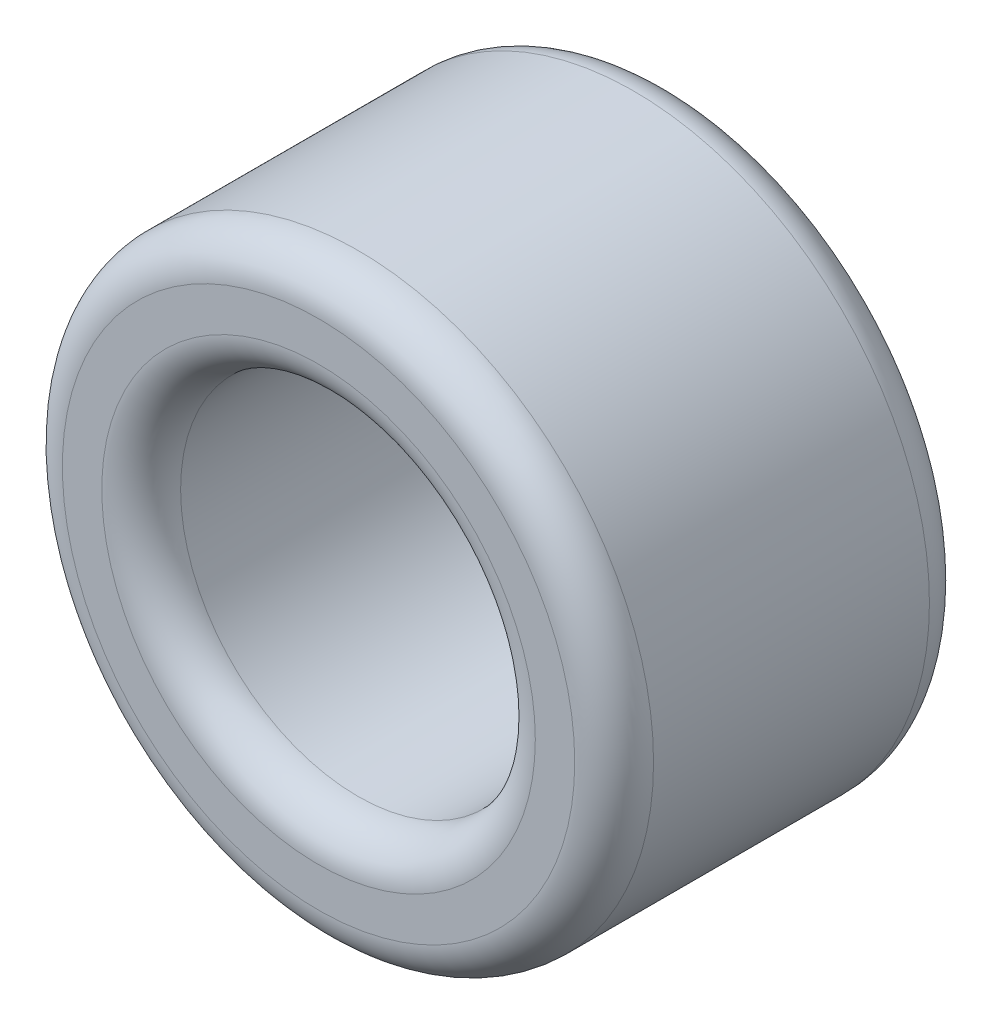
ISO-10303-21;
HEADER;
FILE_DESCRIPTION(('STEP AP214'),'2;1');
FILE_NAME('part.step','',(''),(''),'','','');
FILE_SCHEMA(('AUTOMOTIVE_DESIGN { 1 0 10303 214 1 1 1 1 }'));
ENDSEC;
DATA;
#1=APPLICATION_CONTEXT('core data for automotive mechanical design processes');
#2=APPLICATION_PROTOCOL_DEFINITION('international standard','automotive_design',2000,#1);
#3=PRODUCT_CONTEXT('',#1,'mechanical');
#4=PRODUCT('Part','Part','',(#3));
#5=PRODUCT_RELATED_PRODUCT_CATEGORY('part','',(#4));
#6=PRODUCT_DEFINITION_FORMATION('','',#4);
#7=PRODUCT_DEFINITION_CONTEXT('part definition',#1,'design');
#8=PRODUCT_DEFINITION('design','',#6,#7);
#9=PRODUCT_DEFINITION_SHAPE('','',#8);
#10=(LENGTH_UNIT() NAMED_UNIT(*) SI_UNIT(.MILLI.,.METRE.));
#11=(NAMED_UNIT(*) PLANE_ANGLE_UNIT() SI_UNIT($,.RADIAN.));
#12=(NAMED_UNIT(*) SI_UNIT($,.STERADIAN.) SOLID_ANGLE_UNIT());
#13=UNCERTAINTY_MEASURE_WITH_UNIT(LENGTH_MEASURE(1.E-05),#10,'distance_accuracy_value','');
#14=(GEOMETRIC_REPRESENTATION_CONTEXT(3) GLOBAL_UNCERTAINTY_ASSIGNED_CONTEXT((#13)) GLOBAL_UNIT_ASSIGNED_CONTEXT((#10,
#11,#12)) REPRESENTATION_CONTEXT('',''));
#15=CARTESIAN_POINT('',(0.,0.,0.));
#16=DIRECTION('',(0.,0.,1.));
#17=DIRECTION('',(1.,0.,0.));
#18=AXIS2_PLACEMENT_3D('',#15,#16,#17);
#19=CARTESIAN_POINT('',(-4.0399708452826,19.3257462338423,60.25));
#20=DIRECTION('',(0.,0.,1.));
#21=DIRECTION('',(1.,0.,0.));
#22=AXIS2_PLACEMENT_3D('',#19,#20,#21);
#23=PLANE('',#22);
#24=CARTESIAN_POINT('',(-4.0399708452826,19.3257462338423,60.25));
#25=DIRECTION('',(0.,0.,1.));
#26=DIRECTION('',(1.,0.,0.));
#27=AXIS2_PLACEMENT_3D('',#24,#25,#26);
#28=CIRCLE('',#27,2.75);
#29=CARTESIAN_POINT('',(-1.2899708452826,19.3257462338423,60.25));
#30=VERTEX_POINT('',#29);
#31=EDGE_CURVE('E50',#30,#30,#28,.F.);
#32=ORIENTED_EDGE('',*,*,#31,.T.);
#33=EDGE_LOOP('',(#32));
#34=FACE_BOUND('',#33,.T.);
#35=CARTESIAN_POINT('',(-4.0399708452826,19.3257462338423,60.25));
#36=DIRECTION('',(0.,0.,1.));
#37=DIRECTION('',(1.,0.,0.));
#38=AXIS2_PLACEMENT_3D('',#35,#36,#37);
#39=CIRCLE('',#38,3.25);
#40=CARTESIAN_POINT('',(-0.789970845282597,19.3257462338423,60.25));
#41=VERTEX_POINT('',#40);
#42=EDGE_CURVE('E54',#41,#41,#39,.T.);
#43=ORIENTED_EDGE('',*,*,#42,.T.);
#44=EDGE_LOOP('',(#43));
#45=FACE_BOUND('',#44,.T.);
#46=ADVANCED_FACE('F39',(#34,#45),#23,.T.);
#47=CARTESIAN_POINT('',(-4.0399708452826,19.3257462338423,55.75));
#48=DIRECTION('',(0.,0.,1.));
#49=DIRECTION('',(1.,0.,0.));
#50=AXIS2_PLACEMENT_3D('',#47,#48,#49);
#51=PLANE('',#50);
#52=CARTESIAN_POINT('',(-4.0399708452826,19.3257462338423,55.75));
#53=DIRECTION('',(0.,0.,1.));
#54=DIRECTION('',(1.,0.,0.));
#55=AXIS2_PLACEMENT_3D('',#52,#53,#54);
#56=CIRCLE('',#55,2.75);
#57=CARTESIAN_POINT('',(-1.2899708452826,19.3257462338423,55.75));
#58=VERTEX_POINT('',#57);
#59=EDGE_CURVE('E65',#58,#58,#56,.T.);
#60=ORIENTED_EDGE('',*,*,#59,.T.);
#61=EDGE_LOOP('',(#60));
#62=FACE_BOUND('',#61,.T.);
#63=CARTESIAN_POINT('',(-4.0399708452826,19.3257462338423,55.75));
#64=DIRECTION('',(0.,0.,1.));
#65=DIRECTION('',(1.,0.,0.));
#66=AXIS2_PLACEMENT_3D('',#63,#64,#65);
#67=CIRCLE('',#66,3.25);
#68=CARTESIAN_POINT('',(-0.789970845282597,19.3257462338423,55.75));
#69=VERTEX_POINT('',#68);
#70=EDGE_CURVE('E68',#69,#69,#67,.F.);
#71=ORIENTED_EDGE('',*,*,#70,.T.);
#72=EDGE_LOOP('',(#71));
#73=FACE_BOUND('',#72,.T.);
#74=ADVANCED_FACE('F72',(#62,#73),#51,.F.);
#75=CARTESIAN_POINT('',(-4.0399708452826,19.3257462338423,60.25));
#76=DIRECTION('',(0.,0.,-1.));
#77=DIRECTION('',(-1.,0.,0.));
#78=AXIS2_PLACEMENT_3D('',#75,#76,#77);
#79=CYLINDRICAL_SURFACE('',#78,3.75);
#80=CARTESIAN_POINT('',(-4.0399708452826,19.3257462338423,56.25));
#81=DIRECTION('',(0.,0.,1.));
#82=DIRECTION('',(1.,0.,0.));
#83=AXIS2_PLACEMENT_3D('',#80,#81,#82);
#84=CIRCLE('',#83,3.75);
#85=CARTESIAN_POINT('',(-0.289970845282597,19.3257462338423,56.25));
#86=VERTEX_POINT('',#85);
#87=EDGE_CURVE('E10',#86,#86,#84,.T.);
#88=ORIENTED_EDGE('',*,*,#87,.T.);
#89=EDGE_LOOP('',(#88));
#90=FACE_BOUND('',#89,.T.);
#91=CARTESIAN_POINT('',(-4.0399708452826,19.3257462338423,59.75));
#92=DIRECTION('',(0.,0.,1.));
#93=DIRECTION('',(1.,0.,0.));
#94=AXIS2_PLACEMENT_3D('',#91,#92,#93);
#95=CIRCLE('',#94,3.75);
#96=CARTESIAN_POINT('',(-0.289970845282597,19.3257462338423,59.75));
#97=VERTEX_POINT('',#96);
#98=EDGE_CURVE('E46',#97,#97,#95,.F.);
#99=ORIENTED_EDGE('',*,*,#98,.T.);
#100=EDGE_LOOP('',(#99));
#101=FACE_BOUND('',#100,.T.);
#102=ADVANCED_FACE('F92',(#90,#101),#79,.T.);
#103=CARTESIAN_POINT('',(-4.0399708452826,19.3257462338423,60.25));
#104=DIRECTION('',(0.,0.,-1.));
#105=DIRECTION('',(-1.,0.,0.));
#106=AXIS2_PLACEMENT_3D('',#103,#104,#105);
#107=CYLINDRICAL_SURFACE('',#106,2.25);
#108=CARTESIAN_POINT('',(-4.0399708452826,19.3257462338423,56.25));
#109=DIRECTION('',(0.,0.,1.));
#110=DIRECTION('',(1.,0.,0.));
#111=AXIS2_PLACEMENT_3D('',#108,#109,#110);
#112=CIRCLE('',#111,2.25);
#113=CARTESIAN_POINT('',(-1.7899708452826,19.3257462338423,56.25));
#114=VERTEX_POINT('',#113);
#115=EDGE_CURVE('E59',#114,#114,#112,.F.);
#116=ORIENTED_EDGE('',*,*,#115,.T.);
#117=EDGE_LOOP('',(#116));
#118=FACE_BOUND('',#117,.T.);
#119=CARTESIAN_POINT('',(-4.0399708452826,19.3257462338423,59.75));
#120=DIRECTION('',(0.,0.,1.));
#121=DIRECTION('',(1.,0.,0.));
#122=AXIS2_PLACEMENT_3D('',#119,#120,#121);
#123=CIRCLE('',#122,2.25);
#124=CARTESIAN_POINT('',(-1.7899708452826,19.3257462338423,59.75));
#125=VERTEX_POINT('',#124);
#126=EDGE_CURVE('E62',#125,#125,#123,.T.);
#127=ORIENTED_EDGE('',*,*,#126,.T.);
#128=EDGE_LOOP('',(#127));
#129=FACE_BOUND('',#128,.T.);
#130=ADVANCED_FACE('F97',(#118,#129),#107,.F.);
#131=CARTESIAN_POINT('',(-4.0399708452826,19.3257462338423,56.25));
#132=DIRECTION('',(0.,0.,1.));
#133=DIRECTION('',(1.,0.,0.));
#134=AXIS2_PLACEMENT_3D('',#131,#132,#133);
#135=TOROIDAL_SURFACE('',#134,2.75,0.5);
#136=ORIENTED_EDGE('',*,*,#115,.F.);
#137=EDGE_LOOP('',(#136));
#138=FACE_BOUND('',#137,.T.);
#139=ORIENTED_EDGE('',*,*,#59,.F.);
#140=EDGE_LOOP('',(#139));
#141=FACE_BOUND('',#140,.T.);
#142=ADVANCED_FACE('F83',(#138,#141),#135,.T.);
#143=CARTESIAN_POINT('',(-4.0399708452826,19.3257462338423,59.75));
#144=DIRECTION('',(0.,0.,1.));
#145=DIRECTION('',(1.,0.,0.));
#146=AXIS2_PLACEMENT_3D('',#143,#144,#145);
#147=TOROIDAL_SURFACE('',#146,2.75,0.5);
#148=ORIENTED_EDGE('',*,*,#31,.F.);
#149=EDGE_LOOP('',(#148));
#150=FACE_BOUND('',#149,.T.);
#151=ORIENTED_EDGE('',*,*,#126,.F.);
#152=EDGE_LOOP('',(#151));
#153=FACE_BOUND('',#152,.T.);
#154=ADVANCED_FACE('F77',(#150,#153),#147,.T.);
#155=CARTESIAN_POINT('',(-4.0399708452826,19.3257462338423,56.25));
#156=DIRECTION('',(0.,0.,1.));
#157=DIRECTION('',(1.,0.,0.));
#158=AXIS2_PLACEMENT_3D('',#155,#156,#157);
#159=TOROIDAL_SURFACE('',#158,3.25,0.5);
#160=ORIENTED_EDGE('',*,*,#70,.F.);
#161=EDGE_LOOP('',(#160));
#162=FACE_BOUND('',#161,.T.);
#163=ORIENTED_EDGE('',*,*,#87,.F.);
#164=EDGE_LOOP('',(#163));
#165=FACE_BOUND('',#164,.T.);
#166=ADVANCED_FACE('F74',(#162,#165),#159,.T.);
#167=CARTESIAN_POINT('',(-4.0399708452826,19.3257462338423,59.75));
#168=DIRECTION('',(0.,0.,1.));
#169=DIRECTION('',(1.,0.,0.));
#170=AXIS2_PLACEMENT_3D('',#167,#168,#169);
#171=TOROIDAL_SURFACE('',#170,3.25,0.5);
#172=ORIENTED_EDGE('',*,*,#98,.F.);
#173=EDGE_LOOP('',(#172));
#174=FACE_BOUND('',#173,.T.);
#175=ORIENTED_EDGE('',*,*,#42,.F.);
#176=EDGE_LOOP('',(#175));
#177=FACE_BOUND('',#176,.T.);
#178=ADVANCED_FACE('F41',(#174,#177),#171,.T.);
#179=CLOSED_SHELL('',(#46,#74,#102,#130,#142,#154,#166,#178));
#180=MANIFOLD_SOLID_BREP('B2',#179);
#181=ADVANCED_BREP_SHAPE_REPRESENTATION('',(#18,#180),#14);
#182=SHAPE_DEFINITION_REPRESENTATION(#9,#181);
ENDSEC;
END-ISO-10303-21;
